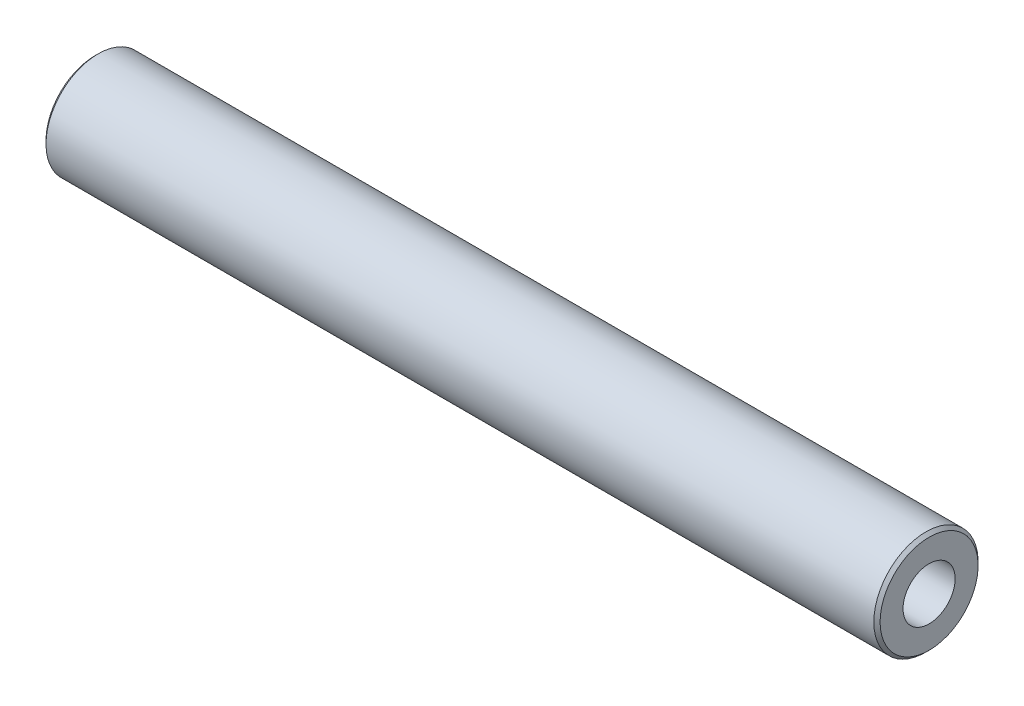
ISO-10303-21;
HEADER;
FILE_DESCRIPTION(('STEP AP214'),'2;1');
FILE_NAME('part.step','',(''),(''),'','','');
FILE_SCHEMA(('AUTOMOTIVE_DESIGN { 1 0 10303 214 1 1 1 1 }'));
ENDSEC;
DATA;
#1=APPLICATION_CONTEXT('core data for automotive mechanical design processes');
#2=APPLICATION_PROTOCOL_DEFINITION('international standard','automotive_design',2000,#1);
#3=PRODUCT_CONTEXT('',#1,'mechanical');
#4=PRODUCT('Part','Part','',(#3));
#5=PRODUCT_RELATED_PRODUCT_CATEGORY('part','',(#4));
#6=PRODUCT_DEFINITION_FORMATION('','',#4);
#7=PRODUCT_DEFINITION_CONTEXT('part definition',#1,'design');
#8=PRODUCT_DEFINITION('design','',#6,#7);
#9=PRODUCT_DEFINITION_SHAPE('','',#8);
#10=(LENGTH_UNIT() NAMED_UNIT(*) SI_UNIT(.MILLI.,.METRE.));
#11=(NAMED_UNIT(*) PLANE_ANGLE_UNIT() SI_UNIT($,.RADIAN.));
#12=(NAMED_UNIT(*) SI_UNIT($,.STERADIAN.) SOLID_ANGLE_UNIT());
#13=UNCERTAINTY_MEASURE_WITH_UNIT(LENGTH_MEASURE(1.E-05),#10,'distance_accuracy_value','');
#14=(GEOMETRIC_REPRESENTATION_CONTEXT(3) GLOBAL_UNCERTAINTY_ASSIGNED_CONTEXT((#13)) GLOBAL_UNIT_ASSIGNED_CONTEXT((#10,
#11,#12)) REPRESENTATION_CONTEXT('',''));
#15=CARTESIAN_POINT('',(0.,0.,0.));
#16=DIRECTION('',(0.,0.,1.));
#17=DIRECTION('',(1.,0.,0.));
#18=AXIS2_PLACEMENT_3D('',#15,#16,#17);
#19=CARTESIAN_POINT('',(0.,0.,0.));
#20=DIRECTION('',(1.,0.,0.));
#21=DIRECTION('',(0.,0.,-1.));
#22=AXIS2_PLACEMENT_3D('',#19,#20,#21);
#23=PLANE('',#22);
#24=CARTESIAN_POINT('',(0.,0.,0.));
#25=DIRECTION('',(1.,0.,0.));
#26=DIRECTION('',(0.,0.,-1.));
#27=AXIS2_PLACEMENT_3D('',#24,#25,#26);
#28=CIRCLE('',#27,4.69999999999996);
#29=CARTESIAN_POINT('',(0.,0.,-4.69999999999996));
#30=VERTEX_POINT('',#29);
#31=EDGE_CURVE('E11',#30,#30,#28,.F.);
#32=ORIENTED_EDGE('',*,*,#31,.T.);
#33=EDGE_LOOP('',(#32));
#34=FACE_BOUND('',#33,.T.);
#35=CARTESIAN_POINT('',(0.,0.,0.));
#36=DIRECTION('',(-1.,0.,0.));
#37=DIRECTION('',(0.,0.,1.));
#38=AXIS2_PLACEMENT_3D('',#35,#36,#37);
#39=CIRCLE('',#38,2.49999999999999);
#40=CARTESIAN_POINT('',(0.,0.,2.49999999999999));
#41=VERTEX_POINT('',#40);
#42=EDGE_CURVE('E64',#41,#41,#39,.T.);
#43=ORIENTED_EDGE('',*,*,#42,.F.);
#44=EDGE_LOOP('',(#43));
#45=FACE_BOUND('',#44,.T.);
#46=ADVANCED_FACE('F39',(#34,#45),#23,.F.);
#47=CARTESIAN_POINT('',(-1000.,0.,0.));
#48=DIRECTION('',(-1.,0.,0.));
#49=DIRECTION('',(0.,0.,1.));
#50=AXIS2_PLACEMENT_3D('',#47,#48,#49);
#51=CYLINDRICAL_SURFACE('',#50,4.99999999999999);
#52=CARTESIAN_POINT('',(79.7000000000001,0.,0.));
#53=DIRECTION('',(-1.,0.,0.));
#54=DIRECTION('',(0.,0.,1.));
#55=AXIS2_PLACEMENT_3D('',#52,#53,#54);
#56=CIRCLE('',#55,4.99999999999999);
#57=CARTESIAN_POINT('',(79.7000000000001,0.,4.99999999999999));
#58=VERTEX_POINT('',#57);
#59=EDGE_CURVE('E77',#58,#58,#56,.T.);
#60=ORIENTED_EDGE('',*,*,#59,.T.);
#61=EDGE_LOOP('',(#60));
#62=FACE_BOUND('',#61,.T.);
#63=CARTESIAN_POINT('',(0.299999999999967,0.,0.));
#64=DIRECTION('',(1.,0.,0.));
#65=DIRECTION('',(0.,0.,-1.));
#66=AXIS2_PLACEMENT_3D('',#63,#64,#65);
#67=CIRCLE('',#66,4.99999999999999);
#68=CARTESIAN_POINT('',(0.299999999999967,0.,-4.99999999999999));
#69=VERTEX_POINT('',#68);
#70=EDGE_CURVE('E74',#69,#69,#67,.T.);
#71=ORIENTED_EDGE('',*,*,#70,.T.);
#72=EDGE_LOOP('',(#71));
#73=FACE_BOUND('',#72,.T.);
#74=ADVANCED_FACE('F90',(#62,#73),#51,.T.);
#75=CARTESIAN_POINT('',(80.,0.,-4.99999999999999));
#76=DIRECTION('',(-1.,0.,0.));
#77=DIRECTION('',(0.,0.,1.));
#78=AXIS2_PLACEMENT_3D('',#75,#76,#77);
#79=PLANE('',#78);
#80=CARTESIAN_POINT('',(80.,0.,0.));
#81=DIRECTION('',(-1.,0.,0.));
#82=DIRECTION('',(0.,0.,1.));
#83=AXIS2_PLACEMENT_3D('',#80,#81,#82);
#84=CIRCLE('',#83,4.70000000000009);
#85=CARTESIAN_POINT('',(80.,0.,4.70000000000009));
#86=VERTEX_POINT('',#85);
#87=EDGE_CURVE('E47',#86,#86,#84,.F.);
#88=ORIENTED_EDGE('',*,*,#87,.T.);
#89=EDGE_LOOP('',(#88));
#90=FACE_BOUND('',#89,.T.);
#91=CARTESIAN_POINT('',(80.,0.,0.));
#92=DIRECTION('',(1.,0.,0.));
#93=DIRECTION('',(0.,0.,-1.));
#94=AXIS2_PLACEMENT_3D('',#91,#92,#93);
#95=CIRCLE('',#94,2.5);
#96=CARTESIAN_POINT('',(80.,0.,-2.5));
#97=VERTEX_POINT('',#96);
#98=EDGE_CURVE('E63',#97,#97,#95,.T.);
#99=ORIENTED_EDGE('',*,*,#98,.F.);
#100=EDGE_LOOP('',(#99));
#101=FACE_BOUND('',#100,.T.);
#102=ADVANCED_FACE('F82',(#90,#101),#79,.F.);
#103=CARTESIAN_POINT('',(65.,0.,0.));
#104=DIRECTION('',(1.,0.,0.));
#105=DIRECTION('',(0.,0.,-1.));
#106=AXIS2_PLACEMENT_3D('',#103,#104,#105);
#107=CONICAL_SURFACE('',#106,2.5,1.02974425867665);
#108=CARTESIAN_POINT('',(63.4978484524311,0.,0.));
#109=VERTEX_POINT('',#108);
#110=VERTEX_LOOP('',#109);
#111=FACE_BOUND('',#110,.T.);
#112=CARTESIAN_POINT('',(65.,0.,0.));
#113=DIRECTION('',(1.,0.,0.));
#114=DIRECTION('',(0.,0.,-1.));
#115=AXIS2_PLACEMENT_3D('',#112,#113,#114);
#116=CIRCLE('',#115,2.5);
#117=CARTESIAN_POINT('',(65.,0.,-2.5));
#118=VERTEX_POINT('',#117);
#119=EDGE_CURVE('E67',#118,#118,#116,.T.);
#120=ORIENTED_EDGE('',*,*,#119,.T.);
#121=EDGE_LOOP('',(#120));
#122=FACE_BOUND('',#121,.T.);
#123=ADVANCED_FACE('F112',(#111,#122),#107,.F.);
#124=CARTESIAN_POINT('',(80.,0.,0.));
#125=DIRECTION('',(1.,0.,0.));
#126=DIRECTION('',(0.,0.,-1.));
#127=AXIS2_PLACEMENT_3D('',#124,#125,#126);
#128=CYLINDRICAL_SURFACE('',#127,2.5);
#129=ORIENTED_EDGE('',*,*,#119,.F.);
#130=EDGE_LOOP('',(#129));
#131=FACE_BOUND('',#130,.T.);
#132=ORIENTED_EDGE('',*,*,#98,.T.);
#133=EDGE_LOOP('',(#132));
#134=FACE_BOUND('',#133,.T.);
#135=ADVANCED_FACE('F57',(#131,#134),#128,.F.);
#136=CARTESIAN_POINT('',(15.,0.,0.));
#137=DIRECTION('',(-1.,0.,0.));
#138=DIRECTION('',(0.,0.,1.));
#139=AXIS2_PLACEMENT_3D('',#136,#137,#138);
#140=CONICAL_SURFACE('',#139,2.49999999999999,1.02974425867665);
#141=CARTESIAN_POINT('',(16.5021515475689,0.,0.));
#142=VERTEX_POINT('',#141);
#143=VERTEX_LOOP('',#142);
#144=FACE_BOUND('',#143,.T.);
#145=CARTESIAN_POINT('',(15.,0.,0.));
#146=DIRECTION('',(-1.,0.,0.));
#147=DIRECTION('',(0.,0.,1.));
#148=AXIS2_PLACEMENT_3D('',#145,#146,#147);
#149=CIRCLE('',#148,2.49999999999999);
#150=CARTESIAN_POINT('',(15.,0.,2.49999999999999));
#151=VERTEX_POINT('',#150);
#152=EDGE_CURVE('E61',#151,#151,#149,.T.);
#153=ORIENTED_EDGE('',*,*,#152,.T.);
#154=EDGE_LOOP('',(#153));
#155=FACE_BOUND('',#154,.T.);
#156=ADVANCED_FACE('F53',(#144,#155),#140,.F.);
#157=CARTESIAN_POINT('',(0.,0.,0.));
#158=DIRECTION('',(-1.,0.,0.));
#159=DIRECTION('',(0.,0.,1.));
#160=AXIS2_PLACEMENT_3D('',#157,#158,#159);
#161=CYLINDRICAL_SURFACE('',#160,2.49999999999999);
#162=ORIENTED_EDGE('',*,*,#152,.F.);
#163=EDGE_LOOP('',(#162));
#164=FACE_BOUND('',#163,.T.);
#165=ORIENTED_EDGE('',*,*,#42,.T.);
#166=EDGE_LOOP('',(#165));
#167=FACE_BOUND('',#166,.T.);
#168=ADVANCED_FACE('F56',(#164,#167),#161,.F.);
#169=CARTESIAN_POINT('',(79.7000000000001,0.,0.));
#170=DIRECTION('',(-1.,0.,0.));
#171=DIRECTION('',(0.,0.,1.));
#172=AXIS2_PLACEMENT_3D('',#169,#170,#171);
#173=CONICAL_SURFACE('',#172,4.99999999999999,0.785398163397454);
#174=ORIENTED_EDGE('',*,*,#87,.F.);
#175=EDGE_LOOP('',(#174));
#176=FACE_BOUND('',#175,.T.);
#177=ORIENTED_EDGE('',*,*,#59,.F.);
#178=EDGE_LOOP('',(#177));
#179=FACE_BOUND('',#178,.T.);
#180=ADVANCED_FACE('F85',(#176,#179),#173,.T.);
#181=CARTESIAN_POINT('',(0.,0.,0.));
#182=DIRECTION('',(1.,0.,0.));
#183=DIRECTION('',(0.,0.,-1.));
#184=AXIS2_PLACEMENT_3D('',#181,#182,#183);
#185=CONICAL_SURFACE('',#184,4.69999999999996,0.785398163397558);
#186=ORIENTED_EDGE('',*,*,#70,.F.);
#187=EDGE_LOOP('',(#186));
#188=FACE_BOUND('',#187,.T.);
#189=ORIENTED_EDGE('',*,*,#31,.F.);
#190=EDGE_LOOP('',(#189));
#191=FACE_BOUND('',#190,.T.);
#192=ADVANCED_FACE('F41',(#188,#191),#185,.T.);
#193=CLOSED_SHELL('',(#46,#74,#102,#123,#135,#156,#168,#180,#192));
#194=MANIFOLD_SOLID_BREP('B2',#193);
#195=ADVANCED_BREP_SHAPE_REPRESENTATION('',(#18,#194),#14);
#196=SHAPE_DEFINITION_REPRESENTATION(#9,#195);
ENDSEC;
END-ISO-10303-21;
